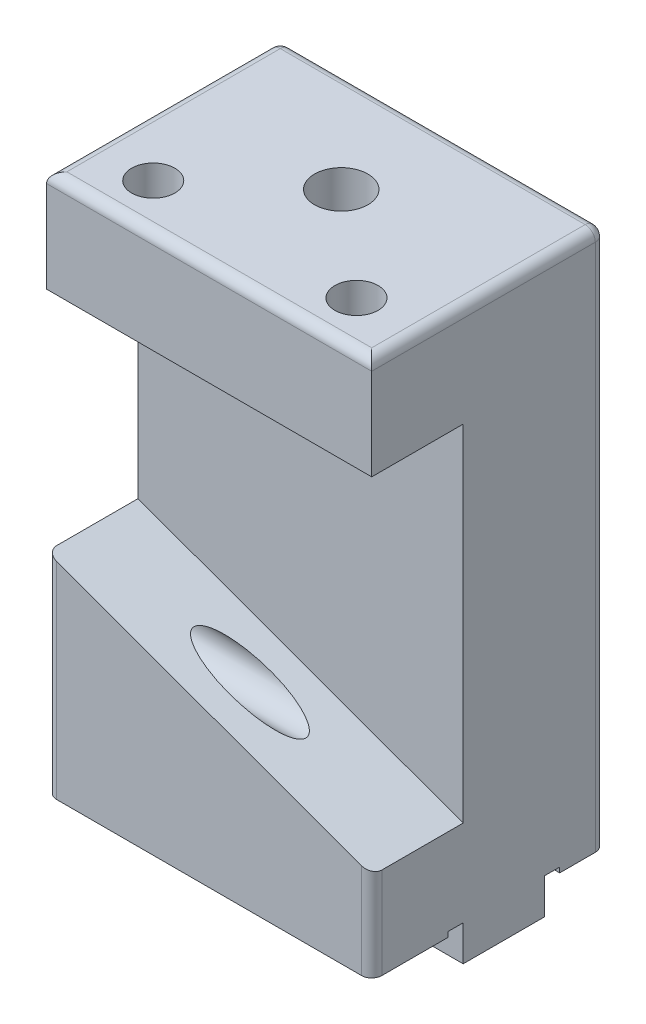
ISO-10303-21;
HEADER;
FILE_DESCRIPTION(('STEP AP214'),'2;1');
FILE_NAME('part.step','',(''),(''),'','','');
FILE_SCHEMA(('AUTOMOTIVE_DESIGN { 1 0 10303 214 1 1 1 1 }'));
ENDSEC;
DATA;
#1=APPLICATION_CONTEXT('core data for automotive mechanical design processes');
#2=APPLICATION_PROTOCOL_DEFINITION('international standard','automotive_design',2000,#1);
#3=PRODUCT_CONTEXT('',#1,'mechanical');
#4=PRODUCT('Part','Part','',(#3));
#5=PRODUCT_RELATED_PRODUCT_CATEGORY('part','',(#4));
#6=PRODUCT_DEFINITION_FORMATION('','',#4);
#7=PRODUCT_DEFINITION_CONTEXT('part definition',#1,'design');
#8=PRODUCT_DEFINITION('design','',#6,#7);
#9=PRODUCT_DEFINITION_SHAPE('','',#8);
#10=(LENGTH_UNIT() NAMED_UNIT(*) SI_UNIT(.MILLI.,.METRE.));
#11=(NAMED_UNIT(*) PLANE_ANGLE_UNIT() SI_UNIT($,.RADIAN.));
#12=(NAMED_UNIT(*) SI_UNIT($,.STERADIAN.) SOLID_ANGLE_UNIT());
#13=UNCERTAINTY_MEASURE_WITH_UNIT(LENGTH_MEASURE(1.E-05),#10,'distance_accuracy_value','');
#14=(GEOMETRIC_REPRESENTATION_CONTEXT(3) GLOBAL_UNCERTAINTY_ASSIGNED_CONTEXT((#13)) GLOBAL_UNIT_ASSIGNED_CONTEXT((#10,
#11,#12)) REPRESENTATION_CONTEXT('',''));
#15=CARTESIAN_POINT('',(0.,0.,0.));
#16=DIRECTION('',(0.,0.,1.));
#17=DIRECTION('',(1.,0.,0.));
#18=AXIS2_PLACEMENT_3D('',#15,#16,#17);
#19=CARTESIAN_POINT('',(0.,0.,46.));
#20=DIRECTION('',(0.,0.,1.));
#21=DIRECTION('',(1.,0.,0.));
#22=AXIS2_PLACEMENT_3D('',#19,#20,#21);
#23=PLANE('',#22);
#24=DIRECTION('',(0.,1.,0.));
#25=VECTOR('',#24,1.);
#26=CARTESIAN_POINT('',(-55.370786516854,207.325842696629,46.));
#27=LINE('',#26,#25);
#28=CARTESIAN_POINT('',(-55.370786516854,187.325842696629,46.));
#29=VERTEX_POINT('',#28);
#30=CARTESIAN_POINT('',(-55.370786516854,205.325842696629,46.));
#31=VERTEX_POINT('',#30);
#32=EDGE_CURVE('E236',#29,#31,#27,.T.);
#33=ORIENTED_EDGE('',*,*,#32,.T.);
#34=DIRECTION('',(-1.,0.,0.));
#35=VECTOR('',#34,1.);
#36=CARTESIAN_POINT('',(-119.370786516854,205.325842696629,46.));
#37=LINE('',#36,#35);
#38=CARTESIAN_POINT('',(-119.370786516854,205.325842696629,46.));
#39=VERTEX_POINT('',#38);
#40=EDGE_CURVE('E11',#31,#39,#37,.T.);
#41=ORIENTED_EDGE('',*,*,#40,.T.);
#42=DIRECTION('',(0.,-1.,0.));
#43=VECTOR('',#42,1.);
#44=CARTESIAN_POINT('',(-119.370786516854,207.325842696629,46.));
#45=LINE('',#44,#43);
#46=CARTESIAN_POINT('',(-119.370786516854,187.325842696629,46.));
#47=VERTEX_POINT('',#46);
#48=EDGE_CURVE('E230',#39,#47,#45,.T.);
#49=ORIENTED_EDGE('',*,*,#48,.T.);
#50=DIRECTION('',(-1.,0.,0.));
#51=VECTOR('',#50,1.);
#52=CARTESIAN_POINT('',(-119.370786516854,187.325842696629,46.));
#53=LINE('',#52,#51);
#54=EDGE_CURVE('E460',#29,#47,#53,.T.);
#55=ORIENTED_EDGE('',*,*,#54,.F.);
#56=EDGE_LOOP('',(#33,#41,#49,#55));
#57=FACE_BOUND('',#56,.T.);
#58=ADVANCED_FACE('F47',(#57),#23,.T.);
#59=CARTESIAN_POINT('',(-55.370786516854,207.325842696629,46.));
#60=DIRECTION('',(-1.,0.,0.));
#61=DIRECTION('',(0.,0.,1.));
#62=AXIS2_PLACEMENT_3D('',#59,#60,#61);
#63=PLANE('',#62);
#64=DIRECTION('',(0.,0.,1.));
#65=VECTOR('',#64,1.);
#66=CARTESIAN_POINT('',(-55.370786516854,119.325842696629,28.));
#67=LINE('',#66,#65);
#68=CARTESIAN_POINT('',(-55.370786516854,119.325842696629,28.));
#69=VERTEX_POINT('',#68);
#70=CARTESIAN_POINT('',(-55.370786516854,119.325842696629,44.));
#71=VERTEX_POINT('',#70);
#72=EDGE_CURVE('E485',#69,#71,#67,.T.);
#73=ORIENTED_EDGE('',*,*,#72,.T.);
#74=DIRECTION('',(0.,1.,0.));
#75=VECTOR('',#74,1.);
#76=CARTESIAN_POINT('',(-55.370786516854,101.325842696629,44.));
#77=LINE('',#76,#75);
#78=CARTESIAN_POINT('',(-55.370786516854,101.325842696629,44.));
#79=VERTEX_POINT('',#78);
#80=EDGE_CURVE('E294',#71,#79,#77,.F.);
#81=ORIENTED_EDGE('',*,*,#80,.T.);
#82=DIRECTION('',(0.,0.,1.));
#83=VECTOR('',#82,1.);
#84=CARTESIAN_POINT('',(-55.370786516854,101.325842696629,46.));
#85=LINE('',#84,#83);
#86=CARTESIAN_POINT('',(-55.370786516854,101.325842696629,31.));
#87=VERTEX_POINT('',#86);
#88=EDGE_CURVE('E211',#87,#79,#85,.T.);
#89=ORIENTED_EDGE('',*,*,#88,.F.);
#90=DIRECTION('',(0.,-1.,0.));
#91=VECTOR('',#90,1.);
#92=CARTESIAN_POINT('',(-55.370786516854,101.325842696629,31.));
#93=LINE('',#92,#91);
#94=CARTESIAN_POINT('',(-55.370786516854,102.325842696629,31.));
#95=VERTEX_POINT('',#94);
#96=EDGE_CURVE('E401',#95,#87,#93,.T.);
#97=ORIENTED_EDGE('',*,*,#96,.F.);
#98=DIRECTION('',(0.,0.,1.));
#99=VECTOR('',#98,1.);
#100=CARTESIAN_POINT('',(-55.370786516854,102.325842696629,31.));
#101=LINE('',#100,#99);
#102=CARTESIAN_POINT('',(-55.370786516854,102.325842696629,28.));
#103=VERTEX_POINT('',#102);
#104=EDGE_CURVE('E221',#103,#95,#101,.T.);
#105=ORIENTED_EDGE('',*,*,#104,.F.);
#106=DIRECTION('',(0.,1.,0.));
#107=VECTOR('',#106,1.);
#108=CARTESIAN_POINT('',(-55.370786516854,102.325842696629,28.));
#109=LINE('',#108,#107);
#110=CARTESIAN_POINT('',(-55.370786516854,95.3258426966294,28.));
#111=VERTEX_POINT('',#110);
#112=EDGE_CURVE('E201',#111,#103,#109,.T.);
#113=ORIENTED_EDGE('',*,*,#112,.F.);
#114=DIRECTION('',(0.,0.,-1.));
#115=VECTOR('',#114,1.);
#116=CARTESIAN_POINT('',(-55.370786516854,95.3258426966294,46.));
#117=LINE('',#116,#115);
#118=CARTESIAN_POINT('',(-55.370786516854,95.3258426966294,12.));
#119=VERTEX_POINT('',#118);
#120=EDGE_CURVE('E218',#111,#119,#117,.T.);
#121=ORIENTED_EDGE('',*,*,#120,.T.);
#122=DIRECTION('',(0.,-1.,0.));
#123=VECTOR('',#122,1.);
#124=CARTESIAN_POINT('',(-55.370786516854,95.3258426966294,12.));
#125=LINE('',#124,#123);
#126=CARTESIAN_POINT('',(-55.370786516854,102.325842696629,12.));
#127=VERTEX_POINT('',#126);
#128=EDGE_CURVE('E421',#127,#119,#125,.T.);
#129=ORIENTED_EDGE('',*,*,#128,.F.);
#130=DIRECTION('',(0.,0.,1.));
#131=VECTOR('',#130,1.);
#132=CARTESIAN_POINT('',(-55.370786516854,102.325842696629,12.));
#133=LINE('',#132,#131);
#134=CARTESIAN_POINT('',(-55.370786516854,102.325842696629,9.));
#135=VERTEX_POINT('',#134);
#136=EDGE_CURVE('E432',#135,#127,#133,.T.);
#137=ORIENTED_EDGE('',*,*,#136,.F.);
#138=DIRECTION('',(0.,1.,0.));
#139=VECTOR('',#138,1.);
#140=CARTESIAN_POINT('',(-55.370786516854,102.325842696629,9.));
#141=LINE('',#140,#139);
#142=CARTESIAN_POINT('',(-55.370786516854,101.325842696629,9.));
#143=VERTEX_POINT('',#142);
#144=EDGE_CURVE('E436',#143,#135,#141,.T.);
#145=ORIENTED_EDGE('',*,*,#144,.F.);
#146=DIRECTION('',(0.,0.,1.));
#147=VECTOR('',#146,1.);
#148=CARTESIAN_POINT('',(-55.370786516854,101.325842696629,9.));
#149=LINE('',#148,#147);
#150=CARTESIAN_POINT('',(-55.370786516854,101.325842696629,2.));
#151=VERTEX_POINT('',#150);
#152=EDGE_CURVE('E223',#151,#143,#149,.T.);
#153=ORIENTED_EDGE('',*,*,#152,.F.);
#154=DIRECTION('',(0.,1.,0.));
#155=VECTOR('',#154,1.);
#156=CARTESIAN_POINT('',(-55.370786516854,207.325842696629,2.));
#157=LINE('',#156,#155);
#158=CARTESIAN_POINT('',(-55.370786516854,205.325842696629,2.));
#159=VERTEX_POINT('',#158);
#160=EDGE_CURVE('E291',#151,#159,#157,.T.);
#161=ORIENTED_EDGE('',*,*,#160,.T.);
#162=DIRECTION('',(0.,0.,-1.));
#163=VECTOR('',#162,1.);
#164=CARTESIAN_POINT('',(-55.370786516854,205.325842696629,46.));
#165=LINE('',#164,#163);
#166=EDGE_CURVE('E288',#159,#31,#165,.F.);
#167=ORIENTED_EDGE('',*,*,#166,.T.);
#168=ORIENTED_EDGE('',*,*,#32,.F.);
#169=DIRECTION('',(0.,0.,1.));
#170=VECTOR('',#169,1.);
#171=CARTESIAN_POINT('',(-55.370786516854,187.325842696629,28.));
#172=LINE('',#171,#170);
#173=CARTESIAN_POINT('',(-55.370786516854,187.325842696629,28.));
#174=VERTEX_POINT('',#173);
#175=EDGE_CURVE('E482',#174,#29,#172,.T.);
#176=ORIENTED_EDGE('',*,*,#175,.F.);
#177=DIRECTION('',(0.,1.,0.));
#178=VECTOR('',#177,1.);
#179=CARTESIAN_POINT('',(-55.370786516854,187.325842696629,28.));
#180=LINE('',#179,#178);
#181=EDGE_CURVE('E464',#69,#174,#180,.T.);
#182=ORIENTED_EDGE('',*,*,#181,.F.);
#183=EDGE_LOOP('',(#73,#81,#89,#97,#105,#113,#121,#129,#137,#145,#153,#161,#167,#168,#176,#182));
#184=FACE_BOUND('',#183,.T.);
#185=ADVANCED_FACE('F216',(#184),#63,.F.);
#186=CARTESIAN_POINT('',(-119.370786516854,207.325842696629,46.));
#187=DIRECTION('',(0.,-1.,0.));
#188=DIRECTION('',(0.,0.,-1.));
#189=AXIS2_PLACEMENT_3D('',#186,#187,#188);
#190=PLANE('',#189);
#191=DIRECTION('',(0.,0.,-1.));
#192=VECTOR('',#191,1.);
#193=CARTESIAN_POINT('',(-57.370786516854,207.325842696629,46.));
#194=LINE('',#193,#192);
#195=CARTESIAN_POINT('',(-57.370786516854,207.325842696629,44.));
#196=VERTEX_POINT('',#195);
#197=CARTESIAN_POINT('',(-57.370786516854,207.325842696629,2.));
#198=VERTEX_POINT('',#197);
#199=EDGE_CURVE('E65',#196,#198,#194,.T.);
#200=ORIENTED_EDGE('',*,*,#199,.T.);
#201=DIRECTION('',(-1.,0.,0.));
#202=VECTOR('',#201,1.);
#203=CARTESIAN_POINT('',(-119.370786516854,207.325842696629,2.));
#204=LINE('',#203,#202);
#205=CARTESIAN_POINT('',(-117.370786516854,207.325842696629,2.));
#206=VERTEX_POINT('',#205);
#207=EDGE_CURVE('E57',#198,#206,#204,.T.);
#208=ORIENTED_EDGE('',*,*,#207,.T.);
#209=DIRECTION('',(0.,0.,-1.));
#210=VECTOR('',#209,1.);
#211=CARTESIAN_POINT('',(-117.370786516854,207.325842696629,46.));
#212=LINE('',#211,#210);
#213=CARTESIAN_POINT('',(-117.370786516854,207.325842696629,44.));
#214=VERTEX_POINT('',#213);
#215=EDGE_CURVE('E328',#206,#214,#212,.F.);
#216=ORIENTED_EDGE('',*,*,#215,.T.);
#217=DIRECTION('',(-1.,0.,0.));
#218=VECTOR('',#217,1.);
#219=CARTESIAN_POINT('',(-55.370786516854,207.325842696629,44.));
#220=LINE('',#219,#218);
#221=EDGE_CURVE('E70',#214,#196,#220,.F.);
#222=ORIENTED_EDGE('',*,*,#221,.T.);
#223=EDGE_LOOP('',(#200,#208,#216,#222));
#224=FACE_BOUND('',#223,.T.);
#225=CARTESIAN_POINT('',(-107.370786516854,207.325842696629,37.));
#226=DIRECTION('',(0.,1.,0.));
#227=DIRECTION('',(0.,0.,1.));
#228=AXIS2_PLACEMENT_3D('',#225,#226,#227);
#229=CIRCLE('',#228,4.24999999999999);
#230=CARTESIAN_POINT('',(-107.370786516854,207.325842696629,41.25));
#231=VERTEX_POINT('',#230);
#232=EDGE_CURVE('E377',#231,#231,#229,.T.);
#233=ORIENTED_EDGE('',*,*,#232,.F.);
#234=EDGE_LOOP('',(#233));
#235=FACE_BOUND('',#234,.T.);
#236=CARTESIAN_POINT('',(-67.370786516854,207.325842696629,37.));
#237=DIRECTION('',(0.,1.,0.));
#238=DIRECTION('',(0.,0.,1.));
#239=AXIS2_PLACEMENT_3D('',#236,#237,#238);
#240=CIRCLE('',#239,4.24999999999999);
#241=CARTESIAN_POINT('',(-67.370786516854,207.325842696629,41.25));
#242=VERTEX_POINT('',#241);
#243=EDGE_CURVE('E388',#242,#242,#240,.T.);
#244=ORIENTED_EDGE('',*,*,#243,.F.);
#245=EDGE_LOOP('',(#244));
#246=FACE_BOUND('',#245,.T.);
#247=CARTESIAN_POINT('',(-87.370786516854,207.325842696629,20.));
#248=DIRECTION('',(0.,1.,0.));
#249=DIRECTION('',(0.,0.,1.));
#250=AXIS2_PLACEMENT_3D('',#247,#248,#249);
#251=CIRCLE('',#250,5.25);
#252=CARTESIAN_POINT('',(-87.370786516854,207.325842696629,25.25));
#253=VERTEX_POINT('',#252);
#254=EDGE_CURVE('E268',#253,#253,#251,.T.);
#255=ORIENTED_EDGE('',*,*,#254,.F.);
#256=EDGE_LOOP('',(#255));
#257=FACE_BOUND('',#256,.T.);
#258=ADVANCED_FACE('F589',(#224,#235,#246,#257),#190,.F.);
#259=CARTESIAN_POINT('',(-119.370786516854,207.325842696629,46.));
#260=DIRECTION('',(1.,0.,0.));
#261=DIRECTION('',(0.,1.,0.));
#262=AXIS2_PLACEMENT_3D('',#259,#260,#261);
#263=PLANE('',#262);
#264=CARTESIAN_POINT('',(-119.370786516854,131.325842696629,37.));
#265=DIRECTION('',(-1.,0.,0.));
#266=DIRECTION('',(0.,-1.,0.));
#267=AXIS2_PLACEMENT_3D('',#264,#265,#266);
#268=CIRCLE('',#267,5.);
#269=CARTESIAN_POINT('',(-119.370786516854,126.325842696629,37.));
#270=VERTEX_POINT('',#269);
#271=EDGE_CURVE('E273',#270,#270,#268,.T.);
#272=ORIENTED_EDGE('',*,*,#271,.F.);
#273=EDGE_LOOP('',(#272));
#274=FACE_BOUND('',#273,.T.);
#275=DIRECTION('',(0.,0.,1.));
#276=VECTOR('',#275,1.);
#277=CARTESIAN_POINT('',(-119.370786516854,101.325842696629,46.));
#278=LINE('',#277,#276);
#279=CARTESIAN_POINT('',(-119.370786516854,101.325842696629,31.));
#280=VERTEX_POINT('',#279);
#281=CARTESIAN_POINT('',(-119.370786516854,101.325842696629,44.));
#282=VERTEX_POINT('',#281);
#283=EDGE_CURVE('E444',#280,#282,#278,.T.);
#284=ORIENTED_EDGE('',*,*,#283,.T.);
#285=DIRECTION('',(0.,-1.,0.));
#286=VECTOR('',#285,1.);
#287=CARTESIAN_POINT('',(-119.370786516854,142.619937689666,44.));
#288=LINE('',#287,#286);
#289=CARTESIAN_POINT('',(-119.370786516854,142.619937689666,44.));
#290=VERTEX_POINT('',#289);
#291=EDGE_CURVE('E310',#282,#290,#288,.F.);
#292=ORIENTED_EDGE('',*,*,#291,.T.);
#293=DIRECTION('',(0.,0.,1.));
#294=VECTOR('',#293,1.);
#295=CARTESIAN_POINT('',(-119.370786516854,142.619937689666,28.));
#296=LINE('',#295,#294);
#297=CARTESIAN_POINT('',(-119.370786516854,142.619937689666,28.));
#298=VERTEX_POINT('',#297);
#299=EDGE_CURVE('E471',#298,#290,#296,.T.);
#300=ORIENTED_EDGE('',*,*,#299,.F.);
#301=DIRECTION('',(0.,-1.,0.));
#302=VECTOR('',#301,1.);
#303=CARTESIAN_POINT('',(-119.370786516854,142.619937689666,28.));
#304=LINE('',#303,#302);
#305=CARTESIAN_POINT('',(-119.370786516854,187.325842696629,28.));
#306=VERTEX_POINT('',#305);
#307=EDGE_CURVE('E455',#306,#298,#304,.T.);
#308=ORIENTED_EDGE('',*,*,#307,.F.);
#309=DIRECTION('',(0.,0.,1.));
#310=VECTOR('',#309,1.);
#311=CARTESIAN_POINT('',(-119.370786516854,187.325842696629,28.));
#312=LINE('',#311,#310);
#313=EDGE_CURVE('E478',#306,#47,#312,.T.);
#314=ORIENTED_EDGE('',*,*,#313,.T.);
#315=ORIENTED_EDGE('',*,*,#48,.F.);
#316=DIRECTION('',(0.,0.,-1.));
#317=VECTOR('',#316,1.);
#318=CARTESIAN_POINT('',(-119.370786516854,205.325842696629,46.));
#319=LINE('',#318,#317);
#320=CARTESIAN_POINT('',(-119.370786516854,205.325842696629,2.));
#321=VERTEX_POINT('',#320);
#322=EDGE_CURVE('E303',#39,#321,#319,.T.);
#323=ORIENTED_EDGE('',*,*,#322,.T.);
#324=DIRECTION('',(0.,-1.,0.));
#325=VECTOR('',#324,1.);
#326=CARTESIAN_POINT('',(-119.370786516854,207.325842696629,2.));
#327=LINE('',#326,#325);
#328=CARTESIAN_POINT('',(-119.370786516854,101.325842696629,2.));
#329=VERTEX_POINT('',#328);
#330=EDGE_CURVE('E306',#321,#329,#327,.T.);
#331=ORIENTED_EDGE('',*,*,#330,.T.);
#332=DIRECTION('',(0.,0.,1.));
#333=VECTOR('',#332,1.);
#334=CARTESIAN_POINT('',(-119.370786516854,101.325842696629,46.));
#335=LINE('',#334,#333);
#336=CARTESIAN_POINT('',(-119.370786516854,101.325842696629,9.));
#337=VERTEX_POINT('',#336);
#338=EDGE_CURVE('E411',#329,#337,#335,.T.);
#339=ORIENTED_EDGE('',*,*,#338,.T.);
#340=DIRECTION('',(0.,1.,0.));
#341=VECTOR('',#340,1.);
#342=CARTESIAN_POINT('',(-119.370786516854,207.325842696629,9.));
#343=LINE('',#342,#341);
#344=CARTESIAN_POINT('',(-119.370786516854,102.325842696629,9.));
#345=VERTEX_POINT('',#344);
#346=EDGE_CURVE('E247',#337,#345,#343,.T.);
#347=ORIENTED_EDGE('',*,*,#346,.T.);
#348=DIRECTION('',(0.,0.,1.));
#349=VECTOR('',#348,1.);
#350=CARTESIAN_POINT('',(-119.370786516854,102.325842696629,46.));
#351=LINE('',#350,#349);
#352=CARTESIAN_POINT('',(-119.370786516854,102.325842696629,12.));
#353=VERTEX_POINT('',#352);
#354=EDGE_CURVE('E251',#345,#353,#351,.T.);
#355=ORIENTED_EDGE('',*,*,#354,.T.);
#356=DIRECTION('',(0.,-1.,0.));
#357=VECTOR('',#356,1.);
#358=CARTESIAN_POINT('',(-119.370786516854,207.325842696629,12.));
#359=LINE('',#358,#357);
#360=CARTESIAN_POINT('',(-119.370786516854,95.3258426966294,12.));
#361=VERTEX_POINT('',#360);
#362=EDGE_CURVE('E448',#353,#361,#359,.T.);
#363=ORIENTED_EDGE('',*,*,#362,.T.);
#364=DIRECTION('',(0.,0.,-1.));
#365=VECTOR('',#364,1.);
#366=CARTESIAN_POINT('',(-119.370786516854,95.3258426966294,46.));
#367=LINE('',#366,#365);
#368=CARTESIAN_POINT('',(-119.370786516854,95.3258426966294,28.));
#369=VERTEX_POINT('',#368);
#370=EDGE_CURVE('E229',#369,#361,#367,.T.);
#371=ORIENTED_EDGE('',*,*,#370,.F.);
#372=DIRECTION('',(0.,1.,0.));
#373=VECTOR('',#372,1.);
#374=CARTESIAN_POINT('',(-119.370786516854,207.325842696629,28.0000000000001));
#375=LINE('',#374,#373);
#376=CARTESIAN_POINT('',(-119.370786516854,102.325842696629,28.));
#377=VERTEX_POINT('',#376);
#378=EDGE_CURVE('E204',#369,#377,#375,.T.);
#379=ORIENTED_EDGE('',*,*,#378,.T.);
#380=DIRECTION('',(0.,0.,1.));
#381=VECTOR('',#380,1.);
#382=CARTESIAN_POINT('',(-119.370786516854,102.325842696629,46.));
#383=LINE('',#382,#381);
#384=CARTESIAN_POINT('',(-119.370786516854,102.325842696629,31.));
#385=VERTEX_POINT('',#384);
#386=EDGE_CURVE('E255',#377,#385,#383,.T.);
#387=ORIENTED_EDGE('',*,*,#386,.T.);
#388=DIRECTION('',(0.,-1.,0.));
#389=VECTOR('',#388,1.);
#390=CARTESIAN_POINT('',(-119.370786516854,207.325842696629,31.));
#391=LINE('',#390,#389);
#392=EDGE_CURVE('E259',#385,#280,#391,.T.);
#393=ORIENTED_EDGE('',*,*,#392,.T.);
#394=EDGE_LOOP('',(#284,#292,#300,#308,#314,#315,#323,#331,#339,#347,#355,#363,#371,#379,#387,#393));
#395=FACE_BOUND('',#394,.T.);
#396=ADVANCED_FACE('F512',(#274,#395),#263,.F.);
#397=CARTESIAN_POINT('',(-119.370786516854,95.3258426966294,46.));
#398=DIRECTION('',(0.,1.,0.));
#399=DIRECTION('',(0.,0.,1.));
#400=AXIS2_PLACEMENT_3D('',#397,#398,#399);
#401=PLANE('',#400);
#402=CARTESIAN_POINT('',(-87.370786516854,95.3258426966294,20.));
#403=DIRECTION('',(0.,1.,0.));
#404=DIRECTION('',(0.,0.,1.));
#405=AXIS2_PLACEMENT_3D('',#402,#403,#404);
#406=CIRCLE('',#405,5.25);
#407=CARTESIAN_POINT('',(-87.370786516854,95.3258426966294,25.25));
#408=VERTEX_POINT('',#407);
#409=EDGE_CURVE('E264',#408,#408,#406,.T.);
#410=ORIENTED_EDGE('',*,*,#409,.T.);
#411=EDGE_LOOP('',(#410));
#412=FACE_BOUND('',#411,.T.);
#413=ORIENTED_EDGE('',*,*,#120,.F.);
#414=DIRECTION('',(1.,0.,0.));
#415=VECTOR('',#414,1.);
#416=CARTESIAN_POINT('',(-145.370786516854,95.3258426966294,28.));
#417=LINE('',#416,#415);
#418=EDGE_CURVE('E197',#369,#111,#417,.T.);
#419=ORIENTED_EDGE('',*,*,#418,.F.);
#420=ORIENTED_EDGE('',*,*,#370,.T.);
#421=DIRECTION('',(1.,0.,0.));
#422=VECTOR('',#421,1.);
#423=CARTESIAN_POINT('',(-145.370786516854,95.3258426966294,12.));
#424=LINE('',#423,#422);
#425=EDGE_CURVE('E227',#361,#119,#424,.T.);
#426=ORIENTED_EDGE('',*,*,#425,.T.);
#427=EDGE_LOOP('',(#413,#419,#420,#426));
#428=FACE_BOUND('',#427,.T.);
#429=ADVANCED_FACE('F226',(#412,#428),#401,.F.);
#430=DIRECTION('',(-1.,0.,0.));
#431=VECTOR('',#430,1.);
#432=CARTESIAN_POINT('',(0.,101.325842696629,46.));
#433=LINE('',#432,#431);
#434=CARTESIAN_POINT('',(-57.370786516854,101.325842696629,46.));
#435=VERTEX_POINT('',#434);
#436=CARTESIAN_POINT('',(-117.370786516854,101.325842696629,46.));
#437=VERTEX_POINT('',#436);
#438=EDGE_CURVE('E243',#435,#437,#433,.T.);
#439=ORIENTED_EDGE('',*,*,#438,.F.);
#440=DIRECTION('',(0.,1.,0.));
#441=VECTOR('',#440,1.);
#442=CARTESIAN_POINT('',(-57.370786516854,119.325842696629,46.));
#443=LINE('',#442,#441);
#444=CARTESIAN_POINT('',(-57.370786516854,120.053783165162,46.));
#445=VERTEX_POINT('',#444);
#446=EDGE_CURVE('E278',#435,#445,#443,.T.);
#447=ORIENTED_EDGE('',*,*,#446,.T.);
#448=DIRECTION('',(0.93969262078591,-0.342020143325666,0.));
#449=VECTOR('',#448,1.);
#450=CARTESIAN_POINT('',(-55.370786516854,119.325842696629,46.));
#451=LINE('',#450,#449);
#452=CARTESIAN_POINT('',(-117.370786516854,141.891997221134,46.));
#453=VERTEX_POINT('',#452);
#454=EDGE_CURVE('E454',#453,#445,#451,.T.);
#455=ORIENTED_EDGE('',*,*,#454,.F.);
#456=DIRECTION('',(0.,-1.,0.));
#457=VECTOR('',#456,1.);
#458=CARTESIAN_POINT('',(-117.370786516854,101.325842696629,46.));
#459=LINE('',#458,#457);
#460=EDGE_CURVE('E263',#453,#437,#459,.T.);
#461=ORIENTED_EDGE('',*,*,#460,.T.);
#462=EDGE_LOOP('',(#439,#447,#455,#461));
#463=FACE_BOUND('',#462,.T.);
#464=ADVANCED_FACE('F534',(#463),#23,.T.);
#465=CARTESIAN_POINT('',(0.,0.,0.));
#466=DIRECTION('',(0.,0.,1.));
#467=DIRECTION('',(1.,0.,0.));
#468=AXIS2_PLACEMENT_3D('',#465,#466,#467);
#469=PLANE('',#468);
#470=DIRECTION('',(-1.,0.,0.));
#471=VECTOR('',#470,1.);
#472=CARTESIAN_POINT('',(0.,101.325842696629,0.));
#473=LINE('',#472,#471);
#474=CARTESIAN_POINT('',(-57.370786516854,101.325842696629,0.));
#475=VERTEX_POINT('',#474);
#476=CARTESIAN_POINT('',(-117.370786516854,101.325842696629,0.));
#477=VERTEX_POINT('',#476);
#478=EDGE_CURVE('E234',#475,#477,#473,.T.);
#479=ORIENTED_EDGE('',*,*,#478,.T.);
#480=DIRECTION('',(0.,-1.,0.));
#481=VECTOR('',#480,1.);
#482=CARTESIAN_POINT('',(-117.370786516854,0.,0.));
#483=LINE('',#482,#481);
#484=CARTESIAN_POINT('',(-117.370786516854,205.325842696629,0.));
#485=VERTEX_POINT('',#484);
#486=EDGE_CURVE('E325',#477,#485,#483,.F.);
#487=ORIENTED_EDGE('',*,*,#486,.T.);
#488=DIRECTION('',(-1.,0.,0.));
#489=VECTOR('',#488,1.);
#490=CARTESIAN_POINT('',(0.,205.325842696629,0.));
#491=LINE('',#490,#489);
#492=CARTESIAN_POINT('',(-57.370786516854,205.325842696629,0.));
#493=VERTEX_POINT('',#492);
#494=EDGE_CURVE('E322',#485,#493,#491,.F.);
#495=ORIENTED_EDGE('',*,*,#494,.T.);
#496=DIRECTION('',(0.,1.,0.));
#497=VECTOR('',#496,1.);
#498=CARTESIAN_POINT('',(-57.370786516854,0.,0.));
#499=LINE('',#498,#497);
#500=EDGE_CURVE('E319',#493,#475,#499,.F.);
#501=ORIENTED_EDGE('',*,*,#500,.T.);
#502=EDGE_LOOP('',(#479,#487,#495,#501));
#503=FACE_BOUND('',#502,.T.);
#504=ADVANCED_FACE('F566',(#503),#469,.F.);
#505=CARTESIAN_POINT('',(-119.370786516854,187.325842696629,28.));
#506=DIRECTION('',(0.,1.,0.));
#507=DIRECTION('',(0.,0.,1.));
#508=AXIS2_PLACEMENT_3D('',#505,#506,#507);
#509=PLANE('',#508);
#510=CARTESIAN_POINT('',(-107.370786516854,187.325842696629,37.));
#511=DIRECTION('',(0.,1.,0.));
#512=DIRECTION('',(0.,0.,1.));
#513=AXIS2_PLACEMENT_3D('',#510,#511,#512);
#514=CIRCLE('',#513,4.24999999999999);
#515=CARTESIAN_POINT('',(-107.370786516854,187.325842696629,41.25));
#516=VERTEX_POINT('',#515);
#517=EDGE_CURVE('E384',#516,#516,#514,.T.);
#518=ORIENTED_EDGE('',*,*,#517,.T.);
#519=EDGE_LOOP('',(#518));
#520=FACE_BOUND('',#519,.T.);
#521=CARTESIAN_POINT('',(-67.370786516854,187.325842696629,37.));
#522=DIRECTION('',(0.,1.,0.));
#523=DIRECTION('',(0.,0.,1.));
#524=AXIS2_PLACEMENT_3D('',#521,#522,#523);
#525=CIRCLE('',#524,4.24999999999999);
#526=CARTESIAN_POINT('',(-67.370786516854,187.325842696629,41.25));
#527=VERTEX_POINT('',#526);
#528=EDGE_CURVE('E392',#527,#527,#525,.T.);
#529=ORIENTED_EDGE('',*,*,#528,.T.);
#530=EDGE_LOOP('',(#529));
#531=FACE_BOUND('',#530,.T.);
#532=ORIENTED_EDGE('',*,*,#54,.T.);
#533=ORIENTED_EDGE('',*,*,#313,.F.);
#534=DIRECTION('',(-1.,0.,0.));
#535=VECTOR('',#534,1.);
#536=CARTESIAN_POINT('',(-119.370786516854,187.325842696629,28.));
#537=LINE('',#536,#535);
#538=EDGE_CURVE('E467',#174,#306,#537,.T.);
#539=ORIENTED_EDGE('',*,*,#538,.F.);
#540=ORIENTED_EDGE('',*,*,#175,.T.);
#541=EDGE_LOOP('',(#532,#533,#539,#540));
#542=FACE_BOUND('',#541,.T.);
#543=ADVANCED_FACE('F517',(#520,#531,#542),#509,.F.);
#544=CARTESIAN_POINT('',(-55.370786516854,119.325842696629,28.));
#545=DIRECTION('',(-0.342020143325666,-0.939692620785909,0.));
#546=DIRECTION('',(0.93969262078591,-0.342020143325666,0.));
#547=AXIS2_PLACEMENT_3D('',#544,#545,#546);
#548=PLANE('',#547);
#549=CARTESIAN_POINT('',(-88.3405155503098,131.325842696629,37.));
#550=DIRECTION('',(-0.342020143325666,-0.939692620785909,0.));
#551=DIRECTION('',(-0.93969262078591,0.342020143325666,0.));
#552=AXIS2_PLACEMENT_3D('',#549,#550,#551);
#553=ELLIPSE('',#552,11.6952176006524,4.);
#554=CARTESIAN_POINT('',(-99.3304252281284,135.325842696629,37.));
#555=VERTEX_POINT('',#554);
#556=EDGE_CURVE('E269',#555,#555,#553,.T.);
#557=ORIENTED_EDGE('',*,*,#556,.T.);
#558=EDGE_LOOP('',(#557));
#559=FACE_BOUND('',#558,.T.);
#560=ORIENTED_EDGE('',*,*,#454,.T.);
#561=CARTESIAN_POINT('',(-57.370786516854,120.053783165162,44.));
#562=DIRECTION('',(-0.342020143325666,-0.939692620785909,0.));
#563=DIRECTION('',(0.93969262078591,-0.342020143325666,0.));
#564=AXIS2_PLACEMENT_3D('',#561,#562,#563);
#565=ELLIPSE('',#564,2.12835554495182,2.);
#566=EDGE_CURVE('E285',#445,#71,#565,.F.);
#567=ORIENTED_EDGE('',*,*,#566,.T.);
#568=ORIENTED_EDGE('',*,*,#72,.F.);
#569=DIRECTION('',(0.93969262078591,-0.342020143325666,0.));
#570=VECTOR('',#569,1.);
#571=CARTESIAN_POINT('',(-55.370786516854,119.325842696629,28.));
#572=LINE('',#571,#570);
#573=EDGE_CURVE('E459',#298,#69,#572,.T.);
#574=ORIENTED_EDGE('',*,*,#573,.F.);
#575=ORIENTED_EDGE('',*,*,#299,.T.);
#576=CARTESIAN_POINT('',(-117.370786516854,141.891997221134,44.));
#577=DIRECTION('',(-0.342020143325666,-0.939692620785909,0.));
#578=DIRECTION('',(-0.93969262078591,0.342020143325666,0.));
#579=AXIS2_PLACEMENT_3D('',#576,#577,#578);
#580=ELLIPSE('',#579,2.12835554495182,2.);
#581=EDGE_CURVE('E282',#290,#453,#580,.F.);
#582=ORIENTED_EDGE('',*,*,#581,.T.);
#583=EDGE_LOOP('',(#560,#567,#568,#574,#575,#582));
#584=FACE_BOUND('',#583,.T.);
#585=ADVANCED_FACE('F525',(#559,#584),#548,.F.);
#586=CARTESIAN_POINT('',(0.,0.,28.));
#587=DIRECTION('',(0.,0.,-1.));
#588=DIRECTION('',(-1.,0.,0.));
#589=AXIS2_PLACEMENT_3D('',#586,#587,#588);
#590=PLANE('',#589);
#591=ORIENTED_EDGE('',*,*,#307,.T.);
#592=ORIENTED_EDGE('',*,*,#573,.T.);
#593=ORIENTED_EDGE('',*,*,#181,.T.);
#594=ORIENTED_EDGE('',*,*,#538,.T.);
#595=EDGE_LOOP('',(#591,#592,#593,#594));
#596=FACE_BOUND('',#595,.T.);
#597=ADVANCED_FACE('F522',(#596),#590,.F.);
#598=CARTESIAN_POINT('',(-145.370786516854,102.325842696629,12.));
#599=DIRECTION('',(0.,1.,0.));
#600=DIRECTION('',(0.,0.,1.));
#601=AXIS2_PLACEMENT_3D('',#598,#599,#600);
#602=PLANE('',#601);
#603=DIRECTION('',(1.,0.,0.));
#604=VECTOR('',#603,1.);
#605=CARTESIAN_POINT('',(-145.370786516854,102.325842696629,9.));
#606=LINE('',#605,#604);
#607=EDGE_CURVE('E422',#345,#135,#606,.T.);
#608=ORIENTED_EDGE('',*,*,#607,.T.);
#609=ORIENTED_EDGE('',*,*,#136,.T.);
#610=DIRECTION('',(1.,0.,0.));
#611=VECTOR('',#610,1.);
#612=CARTESIAN_POINT('',(-145.370786516854,102.325842696629,12.));
#613=LINE('',#612,#611);
#614=EDGE_CURVE('E425',#353,#127,#613,.T.);
#615=ORIENTED_EDGE('',*,*,#614,.F.);
#616=ORIENTED_EDGE('',*,*,#354,.F.);
#617=EDGE_LOOP('',(#608,#609,#615,#616));
#618=FACE_BOUND('',#617,.T.);
#619=ADVANCED_FACE('F549',(#618),#602,.F.);
#620=CARTESIAN_POINT('',(-145.370786516854,102.325842696629,9.));
#621=DIRECTION('',(0.,0.,-1.));
#622=DIRECTION('',(-1.,0.,0.));
#623=AXIS2_PLACEMENT_3D('',#620,#621,#622);
#624=PLANE('',#623);
#625=DIRECTION('',(1.,0.,0.));
#626=VECTOR('',#625,1.);
#627=CARTESIAN_POINT('',(-145.370786516854,101.325842696629,9.));
#628=LINE('',#627,#626);
#629=EDGE_CURVE('E417',#337,#143,#628,.T.);
#630=ORIENTED_EDGE('',*,*,#629,.T.);
#631=ORIENTED_EDGE('',*,*,#144,.T.);
#632=ORIENTED_EDGE('',*,*,#607,.F.);
#633=ORIENTED_EDGE('',*,*,#346,.F.);
#634=EDGE_LOOP('',(#630,#631,#632,#633));
#635=FACE_BOUND('',#634,.T.);
#636=ADVANCED_FACE('F556',(#635),#624,.F.);
#637=CARTESIAN_POINT('',(-145.370786516854,95.3258426966294,12.));
#638=DIRECTION('',(0.,0.,1.));
#639=DIRECTION('',(1.,0.,0.));
#640=AXIS2_PLACEMENT_3D('',#637,#638,#639);
#641=PLANE('',#640);
#642=ORIENTED_EDGE('',*,*,#614,.T.);
#643=ORIENTED_EDGE('',*,*,#128,.T.);
#644=ORIENTED_EDGE('',*,*,#425,.F.);
#645=ORIENTED_EDGE('',*,*,#362,.F.);
#646=EDGE_LOOP('',(#642,#643,#644,#645));
#647=FACE_BOUND('',#646,.T.);
#648=ADVANCED_FACE('F547',(#647),#641,.F.);
#649=CARTESIAN_POINT('',(-145.370786516854,101.325842696629,9.));
#650=DIRECTION('',(0.,1.,0.));
#651=DIRECTION('',(0.,0.,1.));
#652=AXIS2_PLACEMENT_3D('',#649,#650,#651);
#653=PLANE('',#652);
#654=ORIENTED_EDGE('',*,*,#338,.F.);
#655=CARTESIAN_POINT('',(-117.370786516854,101.325842696629,2.));
#656=DIRECTION('',(0.,1.,0.));
#657=DIRECTION('',(0.,0.,1.));
#658=AXIS2_PLACEMENT_3D('',#655,#656,#657);
#659=CIRCLE('',#658,2.);
#660=EDGE_CURVE('E316',#329,#477,#659,.F.);
#661=ORIENTED_EDGE('',*,*,#660,.T.);
#662=ORIENTED_EDGE('',*,*,#478,.F.);
#663=CARTESIAN_POINT('',(-57.370786516854,101.325842696629,2.));
#664=DIRECTION('',(0.,1.,0.));
#665=DIRECTION('',(0.,0.,1.));
#666=AXIS2_PLACEMENT_3D('',#663,#664,#665);
#667=CIRCLE('',#666,2.);
#668=EDGE_CURVE('E313',#475,#151,#667,.F.);
#669=ORIENTED_EDGE('',*,*,#668,.T.);
#670=ORIENTED_EDGE('',*,*,#152,.T.);
#671=ORIENTED_EDGE('',*,*,#629,.F.);
#672=EDGE_LOOP('',(#654,#661,#662,#669,#670,#671));
#673=FACE_BOUND('',#672,.T.);
#674=ADVANCED_FACE('F560',(#673),#653,.F.);
#675=CARTESIAN_POINT('',(-145.370786516854,101.325842696629,31.));
#676=DIRECTION('',(0.,0.,1.));
#677=DIRECTION('',(1.,0.,0.));
#678=AXIS2_PLACEMENT_3D('',#675,#676,#677);
#679=PLANE('',#678);
#680=DIRECTION('',(1.,0.,0.));
#681=VECTOR('',#680,1.);
#682=CARTESIAN_POINT('',(-145.370786516854,102.325842696629,31.));
#683=LINE('',#682,#681);
#684=EDGE_CURVE('E412',#385,#95,#683,.T.);
#685=ORIENTED_EDGE('',*,*,#684,.T.);
#686=ORIENTED_EDGE('',*,*,#96,.T.);
#687=DIRECTION('',(1.,0.,0.));
#688=VECTOR('',#687,1.);
#689=CARTESIAN_POINT('',(-145.370786516854,101.325842696629,31.));
#690=LINE('',#689,#688);
#691=EDGE_CURVE('E408',#280,#87,#690,.T.);
#692=ORIENTED_EDGE('',*,*,#691,.F.);
#693=ORIENTED_EDGE('',*,*,#392,.F.);
#694=EDGE_LOOP('',(#685,#686,#692,#693));
#695=FACE_BOUND('',#694,.T.);
#696=ADVANCED_FACE('F541',(#695),#679,.F.);
#697=CARTESIAN_POINT('',(-145.370786516854,102.325842696629,31.));
#698=DIRECTION('',(0.,1.,0.));
#699=DIRECTION('',(0.,0.,1.));
#700=AXIS2_PLACEMENT_3D('',#697,#698,#699);
#701=PLANE('',#700);
#702=DIRECTION('',(1.,0.,0.));
#703=VECTOR('',#702,1.);
#704=CARTESIAN_POINT('',(-145.370786516854,102.325842696629,28.));
#705=LINE('',#704,#703);
#706=EDGE_CURVE('E210',#377,#103,#705,.T.);
#707=ORIENTED_EDGE('',*,*,#706,.T.);
#708=ORIENTED_EDGE('',*,*,#104,.T.);
#709=ORIENTED_EDGE('',*,*,#684,.F.);
#710=ORIENTED_EDGE('',*,*,#386,.F.);
#711=EDGE_LOOP('',(#707,#708,#709,#710));
#712=FACE_BOUND('',#711,.T.);
#713=ADVANCED_FACE('F544',(#712),#701,.F.);
#714=CARTESIAN_POINT('',(-145.370786516854,102.325842696629,28.));
#715=DIRECTION('',(0.,0.,-1.));
#716=DIRECTION('',(0.,1.,0.));
#717=AXIS2_PLACEMENT_3D('',#714,#715,#716);
#718=PLANE('',#717);
#719=ORIENTED_EDGE('',*,*,#418,.T.);
#720=ORIENTED_EDGE('',*,*,#112,.T.);
#721=ORIENTED_EDGE('',*,*,#706,.F.);
#722=ORIENTED_EDGE('',*,*,#378,.F.);
#723=EDGE_LOOP('',(#719,#720,#721,#722));
#724=FACE_BOUND('',#723,.T.);
#725=ADVANCED_FACE('F199',(#724),#718,.F.);
#726=CARTESIAN_POINT('',(-145.370786516854,101.325842696629,46.));
#727=DIRECTION('',(0.,1.,0.));
#728=DIRECTION('',(0.,0.,1.));
#729=AXIS2_PLACEMENT_3D('',#726,#727,#728);
#730=PLANE('',#729);
#731=ORIENTED_EDGE('',*,*,#88,.T.);
#732=CARTESIAN_POINT('',(-57.370786516854,101.325842696629,44.));
#733=DIRECTION('',(0.,1.,0.));
#734=DIRECTION('',(0.,0.,1.));
#735=AXIS2_PLACEMENT_3D('',#732,#733,#734);
#736=CIRCLE('',#735,2.);
#737=EDGE_CURVE('E300',#79,#435,#736,.F.);
#738=ORIENTED_EDGE('',*,*,#737,.T.);
#739=ORIENTED_EDGE('',*,*,#438,.T.);
#740=CARTESIAN_POINT('',(-117.370786516854,101.325842696629,44.));
#741=DIRECTION('',(0.,1.,0.));
#742=DIRECTION('',(0.,0.,1.));
#743=AXIS2_PLACEMENT_3D('',#740,#741,#742);
#744=CIRCLE('',#743,2.);
#745=EDGE_CURVE('E297',#437,#282,#744,.F.);
#746=ORIENTED_EDGE('',*,*,#745,.T.);
#747=ORIENTED_EDGE('',*,*,#283,.F.);
#748=ORIENTED_EDGE('',*,*,#691,.T.);
#749=EDGE_LOOP('',(#731,#738,#739,#746,#747,#748));
#750=FACE_BOUND('',#749,.T.);
#751=ADVANCED_FACE('F537',(#750),#730,.F.);
#752=CARTESIAN_POINT('',(-87.370786516854,-65.6741573033706,20.));
#753=DIRECTION('',(0.,1.,0.));
#754=DIRECTION('',(0.,0.,1.));
#755=AXIS2_PLACEMENT_3D('',#752,#753,#754);
#756=CYLINDRICAL_SURFACE('',#755,5.25);
#757=ORIENTED_EDGE('',*,*,#254,.T.);
#758=EDGE_LOOP('',(#757));
#759=FACE_BOUND('',#758,.T.);
#760=ORIENTED_EDGE('',*,*,#409,.F.);
#761=EDGE_LOOP('',(#760));
#762=FACE_BOUND('',#761,.T.);
#763=ADVANCED_FACE('F737',(#759,#762),#756,.F.);
#764=CARTESIAN_POINT('',(-67.370786516854,207.325842696629,37.));
#765=DIRECTION('',(0.,1.,0.));
#766=DIRECTION('',(0.,0.,1.));
#767=AXIS2_PLACEMENT_3D('',#764,#765,#766);
#768=CYLINDRICAL_SURFACE('',#767,4.24999999999999);
#769=ORIENTED_EDGE('',*,*,#243,.T.);
#770=EDGE_LOOP('',(#769));
#771=FACE_BOUND('',#770,.T.);
#772=ORIENTED_EDGE('',*,*,#528,.F.);
#773=EDGE_LOOP('',(#772));
#774=FACE_BOUND('',#773,.T.);
#775=ADVANCED_FACE('F727',(#771,#774),#768,.F.);
#776=CARTESIAN_POINT('',(-107.370786516854,207.325842696629,37.));
#777=DIRECTION('',(0.,1.,0.));
#778=DIRECTION('',(0.,0.,1.));
#779=AXIS2_PLACEMENT_3D('',#776,#777,#778);
#780=CYLINDRICAL_SURFACE('',#779,4.24999999999999);
#781=ORIENTED_EDGE('',*,*,#232,.T.);
#782=EDGE_LOOP('',(#781));
#783=FACE_BOUND('',#782,.T.);
#784=ORIENTED_EDGE('',*,*,#517,.F.);
#785=EDGE_LOOP('',(#784));
#786=FACE_BOUND('',#785,.T.);
#787=ADVANCED_FACE('F717',(#783,#786),#780,.F.);
#788=CARTESIAN_POINT('',(-113.370786516854,131.325842696629,37.));
#789=DIRECTION('',(-1.,0.,0.));
#790=DIRECTION('',(0.,-1.,0.));
#791=AXIS2_PLACEMENT_3D('',#788,#789,#790);
#792=CYLINDRICAL_SURFACE('',#791,5.);
#793=CARTESIAN_POINT('',(-113.370786516854,131.325842696629,37.));
#794=DIRECTION('',(-1.,0.,0.));
#795=DIRECTION('',(0.,-1.,0.));
#796=AXIS2_PLACEMENT_3D('',#793,#794,#795);
#797=CIRCLE('',#796,5.);
#798=CARTESIAN_POINT('',(-113.370786516854,126.325842696629,37.));
#799=VERTEX_POINT('',#798);
#800=EDGE_CURVE('E373',#799,#799,#797,.T.);
#801=ORIENTED_EDGE('',*,*,#800,.F.);
#802=EDGE_LOOP('',(#801));
#803=FACE_BOUND('',#802,.T.);
#804=ORIENTED_EDGE('',*,*,#271,.T.);
#805=EDGE_LOOP('',(#804));
#806=FACE_BOUND('',#805,.T.);
#807=ADVANCED_FACE('F707',(#803,#806),#792,.F.);
#808=CARTESIAN_POINT('',(-113.370786516854,131.325842696629,37.));
#809=DIRECTION('',(-1.,0.,0.));
#810=DIRECTION('',(0.,-1.,0.));
#811=AXIS2_PLACEMENT_3D('',#808,#809,#810);
#812=PLANE('',#811);
#813=CARTESIAN_POINT('',(-113.370786516854,131.325842696629,37.));
#814=DIRECTION('',(-1.,0.,0.));
#815=DIRECTION('',(0.,-1.,0.));
#816=AXIS2_PLACEMENT_3D('',#813,#814,#815);
#817=CIRCLE('',#816,4.);
#818=CARTESIAN_POINT('',(-113.370786516854,127.325842696629,37.));
#819=VERTEX_POINT('',#818);
#820=EDGE_CURVE('E274',#819,#819,#817,.T.);
#821=ORIENTED_EDGE('',*,*,#820,.F.);
#822=EDGE_LOOP('',(#821));
#823=FACE_BOUND('',#822,.T.);
#824=ORIENTED_EDGE('',*,*,#800,.T.);
#825=EDGE_LOOP('',(#824));
#826=FACE_BOUND('',#825,.T.);
#827=ADVANCED_FACE('F698',(#823,#826),#812,.T.);
#828=CARTESIAN_POINT('',(-63.370786516854,131.325842696629,37.));
#829=DIRECTION('',(-1.,0.,0.));
#830=DIRECTION('',(0.,-1.,0.));
#831=AXIS2_PLACEMENT_3D('',#828,#829,#830);
#832=CYLINDRICAL_SURFACE('',#831,4.);
#833=ORIENTED_EDGE('',*,*,#820,.T.);
#834=EDGE_LOOP('',(#833));
#835=FACE_BOUND('',#834,.T.);
#836=ORIENTED_EDGE('',*,*,#556,.F.);
#837=EDGE_LOOP('',(#836));
#838=FACE_BOUND('',#837,.T.);
#839=ADVANCED_FACE('F610',(#835,#838),#832,.F.);
#840=CARTESIAN_POINT('',(-57.370786516854,0.,44.));
#841=DIRECTION('',(0.,-1.,0.));
#842=DIRECTION('',(0.,0.,-1.));
#843=AXIS2_PLACEMENT_3D('',#840,#841,#842);
#844=CYLINDRICAL_SURFACE('',#843,2.);
#845=ORIENTED_EDGE('',*,*,#737,.F.);
#846=ORIENTED_EDGE('',*,*,#80,.F.);
#847=ORIENTED_EDGE('',*,*,#566,.F.);
#848=ORIENTED_EDGE('',*,*,#446,.F.);
#849=EDGE_LOOP('',(#845,#846,#847,#848));
#850=FACE_BOUND('',#849,.T.);
#851=ADVANCED_FACE('F531',(#850),#844,.T.);
#852=CARTESIAN_POINT('',(-117.370786516854,0.,44.));
#853=DIRECTION('',(0.,1.,0.));
#854=DIRECTION('',(-1.,0.,0.));
#855=AXIS2_PLACEMENT_3D('',#852,#853,#854);
#856=CYLINDRICAL_SURFACE('',#855,2.);
#857=ORIENTED_EDGE('',*,*,#581,.F.);
#858=ORIENTED_EDGE('',*,*,#291,.F.);
#859=ORIENTED_EDGE('',*,*,#745,.F.);
#860=ORIENTED_EDGE('',*,*,#460,.F.);
#861=EDGE_LOOP('',(#857,#858,#859,#860));
#862=FACE_BOUND('',#861,.T.);
#863=ADVANCED_FACE('F609',(#862),#856,.T.);
#864=CARTESIAN_POINT('',(-57.370786516854,207.325842696629,2.));
#865=DIRECTION('',(0.,1.,0.));
#866=DIRECTION('',(0.,0.,1.));
#867=AXIS2_PLACEMENT_3D('',#864,#865,#866);
#868=CYLINDRICAL_SURFACE('',#867,2.);
#869=ORIENTED_EDGE('',*,*,#668,.F.);
#870=ORIENTED_EDGE('',*,*,#500,.F.);
#871=CARTESIAN_POINT('',(-57.370786516854,205.325842696629,2.));
#872=DIRECTION('',(0.,1.,0.));
#873=DIRECTION('',(0.,0.,1.));
#874=AXIS2_PLACEMENT_3D('',#871,#872,#873);
#875=CIRCLE('',#874,2.);
#876=EDGE_CURVE('E51',#159,#493,#875,.T.);
#877=ORIENTED_EDGE('',*,*,#876,.F.);
#878=ORIENTED_EDGE('',*,*,#160,.F.);
#879=EDGE_LOOP('',(#869,#870,#877,#878));
#880=FACE_BOUND('',#879,.T.);
#881=ADVANCED_FACE('F49',(#880),#868,.T.);
#882=CARTESIAN_POINT('',(-57.370786516854,205.325842696629,46.));
#883=DIRECTION('',(0.,0.,-1.));
#884=DIRECTION('',(-1.,0.,0.));
#885=AXIS2_PLACEMENT_3D('',#882,#883,#884);
#886=CYLINDRICAL_SURFACE('',#885,2.);
#887=CARTESIAN_POINT('',(-57.370786516854,205.325842696629,44.));
#888=DIRECTION('',(0.707106781186547,0.,-0.707106781186547));
#889=DIRECTION('',(0.707106781186547,0.,0.707106781186547));
#890=AXIS2_PLACEMENT_3D('',#887,#888,#889);
#891=ELLIPSE('',#890,2.82842712474619,2.);
#892=EDGE_CURVE('E356',#31,#196,#891,.F.);
#893=ORIENTED_EDGE('',*,*,#892,.F.);
#894=ORIENTED_EDGE('',*,*,#166,.F.);
#895=CARTESIAN_POINT('',(-57.370786516854,205.325842696629,2.));
#896=DIRECTION('',(0.,0.,-1.));
#897=DIRECTION('',(-1.,0.,0.));
#898=AXIS2_PLACEMENT_3D('',#895,#896,#897);
#899=CIRCLE('',#898,2.);
#900=EDGE_CURVE('E359',#198,#159,#899,.T.);
#901=ORIENTED_EDGE('',*,*,#900,.F.);
#902=ORIENTED_EDGE('',*,*,#199,.F.);
#903=EDGE_LOOP('',(#893,#894,#901,#902));
#904=FACE_BOUND('',#903,.T.);
#905=ADVANCED_FACE('F501',(#904),#886,.T.);
#906=CARTESIAN_POINT('',(-57.370786516854,205.325842696629,2.));
#907=DIRECTION('',(1.,0.,0.));
#908=DIRECTION('',(0.,0.,-1.));
#909=AXIS2_PLACEMENT_3D('',#906,#907,#908);
#910=SPHERICAL_SURFACE('',#909,2.);
#911=ORIENTED_EDGE('',*,*,#900,.T.);
#912=ORIENTED_EDGE('',*,*,#876,.T.);
#913=CARTESIAN_POINT('',(-57.370786516854,205.325842696629,2.));
#914=DIRECTION('',(1.,0.,0.));
#915=DIRECTION('',(0.,0.,-1.));
#916=AXIS2_PLACEMENT_3D('',#913,#914,#915);
#917=CIRCLE('',#916,2.);
#918=EDGE_CURVE('E352',#198,#493,#917,.F.);
#919=ORIENTED_EDGE('',*,*,#918,.F.);
#920=EDGE_LOOP('',(#911,#912,#919));
#921=FACE_BOUND('',#920,.T.);
#922=ADVANCED_FACE('F620',(#921),#910,.T.);
#923=CARTESIAN_POINT('',(0.,205.325842696629,44.));
#924=DIRECTION('',(1.,0.,0.));
#925=DIRECTION('',(0.,0.,-1.));
#926=AXIS2_PLACEMENT_3D('',#923,#924,#925);
#927=CYLINDRICAL_SURFACE('',#926,2.);
#928=ORIENTED_EDGE('',*,*,#892,.T.);
#929=ORIENTED_EDGE('',*,*,#221,.F.);
#930=CARTESIAN_POINT('',(-117.370786516854,205.325842696629,44.));
#931=DIRECTION('',(-0.707106781186547,0.,-0.707106781186547));
#932=DIRECTION('',(0.707106781186547,0.,-0.707106781186547));
#933=AXIS2_PLACEMENT_3D('',#930,#931,#932);
#934=ELLIPSE('',#933,2.82842712474619,2.);
#935=EDGE_CURVE('E348',#39,#214,#934,.T.);
#936=ORIENTED_EDGE('',*,*,#935,.F.);
#937=ORIENTED_EDGE('',*,*,#40,.F.);
#938=EDGE_LOOP('',(#928,#929,#936,#937));
#939=FACE_BOUND('',#938,.T.);
#940=ADVANCED_FACE('F504',(#939),#927,.T.);
#941=CARTESIAN_POINT('',(-119.370786516854,205.325842696629,2.));
#942=DIRECTION('',(-1.,0.,0.));
#943=DIRECTION('',(0.,0.,1.));
#944=AXIS2_PLACEMENT_3D('',#941,#942,#943);
#945=CYLINDRICAL_SURFACE('',#944,2.);
#946=ORIENTED_EDGE('',*,*,#918,.T.);
#947=ORIENTED_EDGE('',*,*,#494,.F.);
#948=CARTESIAN_POINT('',(-117.370786516854,205.325842696629,2.));
#949=DIRECTION('',(-1.,0.,0.));
#950=DIRECTION('',(0.,0.,1.));
#951=AXIS2_PLACEMENT_3D('',#948,#949,#950);
#952=CIRCLE('',#951,2.);
#953=EDGE_CURVE('E344',#206,#485,#952,.T.);
#954=ORIENTED_EDGE('',*,*,#953,.F.);
#955=ORIENTED_EDGE('',*,*,#207,.F.);
#956=EDGE_LOOP('',(#946,#947,#954,#955));
#957=FACE_BOUND('',#956,.T.);
#958=ADVANCED_FACE('F571',(#957),#945,.T.);
#959=CARTESIAN_POINT('',(-117.370786516854,205.325842696629,46.));
#960=DIRECTION('',(0.,0.,-1.));
#961=DIRECTION('',(-1.,0.,0.));
#962=AXIS2_PLACEMENT_3D('',#959,#960,#961);
#963=CYLINDRICAL_SURFACE('',#962,2.);
#964=ORIENTED_EDGE('',*,*,#935,.T.);
#965=ORIENTED_EDGE('',*,*,#215,.F.);
#966=CARTESIAN_POINT('',(-117.370786516854,205.325842696629,2.));
#967=DIRECTION('',(0.,0.,-1.));
#968=DIRECTION('',(-1.,0.,0.));
#969=AXIS2_PLACEMENT_3D('',#966,#967,#968);
#970=CIRCLE('',#969,2.);
#971=EDGE_CURVE('E341',#321,#206,#970,.T.);
#972=ORIENTED_EDGE('',*,*,#971,.F.);
#973=ORIENTED_EDGE('',*,*,#322,.F.);
#974=EDGE_LOOP('',(#964,#965,#972,#973));
#975=FACE_BOUND('',#974,.T.);
#976=ADVANCED_FACE('F509',(#975),#963,.T.);
#977=CARTESIAN_POINT('',(-117.370786516854,205.325842696629,2.));
#978=DIRECTION('',(0.,1.,0.));
#979=DIRECTION('',(0.,0.,1.));
#980=AXIS2_PLACEMENT_3D('',#977,#978,#979);
#981=SPHERICAL_SURFACE('',#980,2.);
#982=ORIENTED_EDGE('',*,*,#971,.T.);
#983=ORIENTED_EDGE('',*,*,#953,.T.);
#984=CARTESIAN_POINT('',(-117.370786516854,205.325842696629,2.));
#985=DIRECTION('',(0.,1.,0.));
#986=DIRECTION('',(0.,0.,1.));
#987=AXIS2_PLACEMENT_3D('',#984,#985,#986);
#988=CIRCLE('',#987,2.);
#989=EDGE_CURVE('E337',#321,#485,#988,.F.);
#990=ORIENTED_EDGE('',*,*,#989,.F.);
#991=EDGE_LOOP('',(#982,#983,#990));
#992=FACE_BOUND('',#991,.T.);
#993=ADVANCED_FACE('F574',(#992),#981,.T.);
#994=CARTESIAN_POINT('',(-117.370786516854,207.325842696629,2.));
#995=DIRECTION('',(0.,-1.,0.));
#996=DIRECTION('',(1.,0.,0.));
#997=AXIS2_PLACEMENT_3D('',#994,#995,#996);
#998=CYLINDRICAL_SURFACE('',#997,2.);
#999=ORIENTED_EDGE('',*,*,#989,.T.);
#1000=ORIENTED_EDGE('',*,*,#486,.F.);
#1001=ORIENTED_EDGE('',*,*,#660,.F.);
#1002=ORIENTED_EDGE('',*,*,#330,.F.);
#1003=EDGE_LOOP('',(#999,#1000,#1001,#1002));
#1004=FACE_BOUND('',#1003,.T.);
#1005=ADVANCED_FACE('F576',(#1004),#998,.T.);
#1006=CLOSED_SHELL('',(#58,#185,#258,#396,#429,#464,#504,#543,#585,#597,#619,#636,#648,#674,
#696,#713,#725,#751,#763,#775,#787,#807,#827,#839,#851,#863,#881,#905,#922,#940,#958,#976,#993,#1005));
#1007=MANIFOLD_SOLID_BREP('B2',#1006);
#1008=ADVANCED_BREP_SHAPE_REPRESENTATION('',(#18,#1007),#14);
#1009=SHAPE_DEFINITION_REPRESENTATION(#9,#1008);
ENDSEC;
END-ISO-10303-21;
